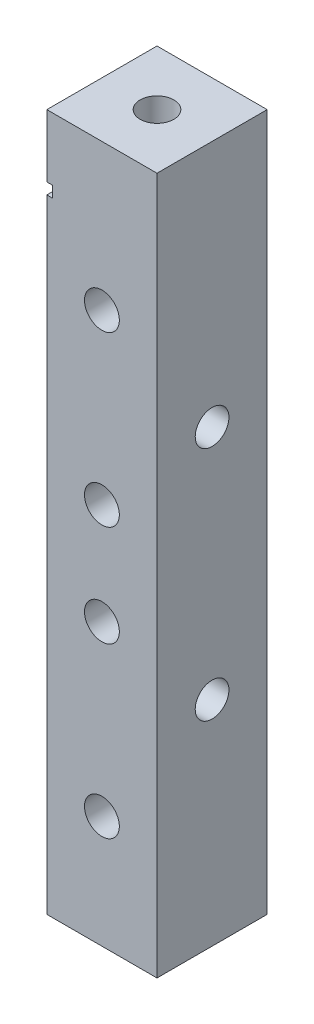
ISO-10303-21;
HEADER;
FILE_DESCRIPTION(('STEP AP214'),'2;1');
FILE_NAME('part.step','',(''),(''),'','','');
FILE_SCHEMA(('AUTOMOTIVE_DESIGN { 1 0 10303 214 1 1 1 1 }'));
ENDSEC;
DATA;
#1=APPLICATION_CONTEXT('core data for automotive mechanical design processes');
#2=APPLICATION_PROTOCOL_DEFINITION('international standard','automotive_design',2000,#1);
#3=PRODUCT_CONTEXT('',#1,'mechanical');
#4=PRODUCT('Part','Part','',(#3));
#5=PRODUCT_RELATED_PRODUCT_CATEGORY('part','',(#4));
#6=PRODUCT_DEFINITION_FORMATION('','',#4);
#7=PRODUCT_DEFINITION_CONTEXT('part definition',#1,'design');
#8=PRODUCT_DEFINITION('design','',#6,#7);
#9=PRODUCT_DEFINITION_SHAPE('','',#8);
#10=(LENGTH_UNIT() NAMED_UNIT(*) SI_UNIT(.MILLI.,.METRE.));
#11=(NAMED_UNIT(*) PLANE_ANGLE_UNIT() SI_UNIT($,.RADIAN.));
#12=(NAMED_UNIT(*) SI_UNIT($,.STERADIAN.) SOLID_ANGLE_UNIT());
#13=UNCERTAINTY_MEASURE_WITH_UNIT(LENGTH_MEASURE(1.E-05),#10,'distance_accuracy_value','');
#14=(GEOMETRIC_REPRESENTATION_CONTEXT(3) GLOBAL_UNCERTAINTY_ASSIGNED_CONTEXT((#13)) GLOBAL_UNIT_ASSIGNED_CONTEXT((#10,
#11,#12)) REPRESENTATION_CONTEXT('',''));
#15=CARTESIAN_POINT('',(0.,0.,0.));
#16=DIRECTION('',(0.,0.,1.));
#17=DIRECTION('',(1.,0.,0.));
#18=AXIS2_PLACEMENT_3D('',#15,#16,#17);
#19=CARTESIAN_POINT('',(-4.9,62.,4.9));
#20=DIRECTION('',(1.,0.,0.));
#21=DIRECTION('',(0.,0.,-1.));
#22=AXIS2_PLACEMENT_3D('',#19,#20,#21);
#23=PLANE('',#22);
#24=DIRECTION('',(0.,-1.,0.));
#25=VECTOR('',#24,1.);
#26=CARTESIAN_POINT('',(-4.9,62.,-4.9));
#27=LINE('',#26,#25);
#28=CARTESIAN_POINT('',(-4.9,62.,-4.9));
#29=VERTEX_POINT('',#28);
#30=CARTESIAN_POINT('',(-4.9,56.4276005837835,-4.9));
#31=VERTEX_POINT('',#30);
#32=EDGE_CURVE('E49',#29,#31,#27,.T.);
#33=ORIENTED_EDGE('',*,*,#32,.T.);
#34=DIRECTION('',(0.,0.,-1.));
#35=VECTOR('',#34,1.);
#36=CARTESIAN_POINT('',(-4.9,56.4276005837835,-4.9));
#37=LINE('',#36,#35);
#38=CARTESIAN_POINT('',(-4.9,56.4276005837835,4.9));
#39=VERTEX_POINT('',#38);
#40=EDGE_CURVE('E131',#39,#31,#37,.T.);
#41=ORIENTED_EDGE('',*,*,#40,.F.);
#42=DIRECTION('',(0.,-1.,0.));
#43=VECTOR('',#42,1.);
#44=CARTESIAN_POINT('',(-4.9,62.,4.9));
#45=LINE('',#44,#43);
#46=CARTESIAN_POINT('',(-4.9,62.,4.9));
#47=VERTEX_POINT('',#46);
#48=EDGE_CURVE('E224',#47,#39,#45,.T.);
#49=ORIENTED_EDGE('',*,*,#48,.F.);
#50=DIRECTION('',(0.,0.,1.));
#51=VECTOR('',#50,1.);
#52=CARTESIAN_POINT('',(-4.9,62.,4.9));
#53=LINE('',#52,#51);
#54=EDGE_CURVE('E203',#29,#47,#53,.T.);
#55=ORIENTED_EDGE('',*,*,#54,.F.);
#56=EDGE_LOOP('',(#33,#41,#49,#55));
#57=FACE_BOUND('',#56,.T.);
#58=ADVANCED_FACE('F39',(#57),#23,.F.);
#59=CARTESIAN_POINT('',(4.9,62.,4.9));
#60=DIRECTION('',(-1.,0.,0.));
#61=DIRECTION('',(0.,0.,1.));
#62=AXIS2_PLACEMENT_3D('',#59,#60,#61);
#63=PLANE('',#62);
#64=CARTESIAN_POINT('',(4.9,40.,0.));
#65=DIRECTION('',(-1.,0.,0.));
#66=DIRECTION('',(0.,0.,1.));
#67=AXIS2_PLACEMENT_3D('',#64,#65,#66);
#68=CIRCLE('',#67,1.5);
#69=CARTESIAN_POINT('',(4.9,40.,1.5));
#70=VERTEX_POINT('',#69);
#71=EDGE_CURVE('E159',#70,#70,#68,.T.);
#72=ORIENTED_EDGE('',*,*,#71,.T.);
#73=EDGE_LOOP('',(#72));
#74=FACE_BOUND('',#73,.T.);
#75=CARTESIAN_POINT('',(4.9,19.,0.));
#76=DIRECTION('',(-1.,0.,0.));
#77=DIRECTION('',(0.,0.,1.));
#78=AXIS2_PLACEMENT_3D('',#75,#76,#77);
#79=CIRCLE('',#78,1.5);
#80=CARTESIAN_POINT('',(4.9,19.,1.5));
#81=VERTEX_POINT('',#80);
#82=EDGE_CURVE('E150',#81,#81,#79,.T.);
#83=ORIENTED_EDGE('',*,*,#82,.T.);
#84=EDGE_LOOP('',(#83));
#85=FACE_BOUND('',#84,.T.);
#86=DIRECTION('',(0.,0.,-1.));
#87=VECTOR('',#86,1.);
#88=CARTESIAN_POINT('',(4.9,0.,4.9));
#89=LINE('',#88,#87);
#90=CARTESIAN_POINT('',(4.9,0.,4.9));
#91=VERTEX_POINT('',#90);
#92=CARTESIAN_POINT('',(4.9,0.,-4.9));
#93=VERTEX_POINT('',#92);
#94=EDGE_CURVE('E197',#91,#93,#89,.T.);
#95=ORIENTED_EDGE('',*,*,#94,.T.);
#96=DIRECTION('',(0.,-1.,0.));
#97=VECTOR('',#96,1.);
#98=CARTESIAN_POINT('',(4.9,62.,-4.9));
#99=LINE('',#98,#97);
#100=CARTESIAN_POINT('',(4.9,62.,-4.9));
#101=VERTEX_POINT('',#100);
#102=EDGE_CURVE('E11',#101,#93,#99,.T.);
#103=ORIENTED_EDGE('',*,*,#102,.F.);
#104=DIRECTION('',(0.,0.,-1.));
#105=VECTOR('',#104,1.);
#106=CARTESIAN_POINT('',(4.9,62.,4.9));
#107=LINE('',#106,#105);
#108=CARTESIAN_POINT('',(4.9,62.,4.9));
#109=VERTEX_POINT('',#108);
#110=EDGE_CURVE('E198',#109,#101,#107,.T.);
#111=ORIENTED_EDGE('',*,*,#110,.F.);
#112=DIRECTION('',(0.,-1.,0.));
#113=VECTOR('',#112,1.);
#114=CARTESIAN_POINT('',(4.9,62.,4.9));
#115=LINE('',#114,#113);
#116=EDGE_CURVE('E208',#109,#91,#115,.T.);
#117=ORIENTED_EDGE('',*,*,#116,.T.);
#118=EDGE_LOOP('',(#95,#103,#111,#117));
#119=FACE_BOUND('',#118,.T.);
#120=ADVANCED_FACE('F41',(#74,#85,#119),#63,.F.);
#121=CARTESIAN_POINT('',(-4.9,62.,-4.9));
#122=DIRECTION('',(0.,0.,1.));
#123=DIRECTION('',(1.,0.,0.));
#124=AXIS2_PLACEMENT_3D('',#121,#122,#123);
#125=PLANE('',#124);
#126=CARTESIAN_POINT('',(0.,10.,-4.9));
#127=DIRECTION('',(0.,0.,-1.));
#128=DIRECTION('',(-1.,0.,0.));
#129=AXIS2_PLACEMENT_3D('',#126,#127,#128);
#130=CIRCLE('',#129,1.55);
#131=CARTESIAN_POINT('',(-1.55,10.,-4.9));
#132=VERTEX_POINT('',#131);
#133=EDGE_CURVE('E164',#132,#132,#130,.T.);
#134=ORIENTED_EDGE('',*,*,#133,.F.);
#135=EDGE_LOOP('',(#134));
#136=FACE_BOUND('',#135,.T.);
#137=CARTESIAN_POINT('',(0.,49.,-4.9));
#138=DIRECTION('',(0.,0.,-1.));
#139=DIRECTION('',(-1.,0.,0.));
#140=AXIS2_PLACEMENT_3D('',#137,#138,#139);
#141=CIRCLE('',#140,1.55);
#142=CARTESIAN_POINT('',(-1.55,49.,-4.9));
#143=VERTEX_POINT('',#142);
#144=EDGE_CURVE('E169',#143,#143,#141,.T.);
#145=ORIENTED_EDGE('',*,*,#144,.F.);
#146=EDGE_LOOP('',(#145));
#147=FACE_BOUND('',#146,.T.);
#148=CARTESIAN_POINT('',(0.,34.,-4.9));
#149=DIRECTION('',(0.,0.,-1.));
#150=DIRECTION('',(-1.,0.,0.));
#151=AXIS2_PLACEMENT_3D('',#148,#149,#150);
#152=CIRCLE('',#151,1.55);
#153=CARTESIAN_POINT('',(-1.55,34.,-4.9));
#154=VERTEX_POINT('',#153);
#155=EDGE_CURVE('E173',#154,#154,#152,.T.);
#156=ORIENTED_EDGE('',*,*,#155,.F.);
#157=EDGE_LOOP('',(#156));
#158=FACE_BOUND('',#157,.T.);
#159=CARTESIAN_POINT('',(0.,25.,-4.9));
#160=DIRECTION('',(0.,0.,-1.));
#161=DIRECTION('',(-1.,0.,0.));
#162=AXIS2_PLACEMENT_3D('',#159,#160,#161);
#163=CIRCLE('',#162,1.55);
#164=CARTESIAN_POINT('',(-1.55,25.,-4.9));
#165=VERTEX_POINT('',#164);
#166=EDGE_CURVE('E163',#165,#165,#163,.T.);
#167=ORIENTED_EDGE('',*,*,#166,.F.);
#168=EDGE_LOOP('',(#167));
#169=FACE_BOUND('',#168,.T.);
#170=DIRECTION('',(0.,-1.,0.));
#171=VECTOR('',#170,1.);
#172=CARTESIAN_POINT('',(-4.4,55.4276005837835,-4.9));
#173=LINE('',#172,#171);
#174=CARTESIAN_POINT('',(-4.4,56.4276005837835,-4.9));
#175=VERTEX_POINT('',#174);
#176=CARTESIAN_POINT('',(-4.4,55.4276005837835,-4.9));
#177=VERTEX_POINT('',#176);
#178=EDGE_CURVE('E122',#175,#177,#173,.T.);
#179=ORIENTED_EDGE('',*,*,#178,.F.);
#180=DIRECTION('',(-1.,0.,0.));
#181=VECTOR('',#180,1.);
#182=CARTESIAN_POINT('',(-4.4,56.4276005837835,-4.9));
#183=LINE('',#182,#181);
#184=EDGE_CURVE('E155',#175,#31,#183,.T.);
#185=ORIENTED_EDGE('',*,*,#184,.T.);
#186=ORIENTED_EDGE('',*,*,#32,.F.);
#187=DIRECTION('',(-1.,0.,0.));
#188=VECTOR('',#187,1.);
#189=CARTESIAN_POINT('',(-4.9,62.,-4.9));
#190=LINE('',#189,#188);
#191=EDGE_CURVE('E93',#101,#29,#190,.T.);
#192=ORIENTED_EDGE('',*,*,#191,.F.);
#193=ORIENTED_EDGE('',*,*,#102,.T.);
#194=DIRECTION('',(-1.,0.,0.));
#195=VECTOR('',#194,1.);
#196=CARTESIAN_POINT('',(-4.9,0.,-4.9));
#197=LINE('',#196,#195);
#198=CARTESIAN_POINT('',(-4.9,0.,-4.9));
#199=VERTEX_POINT('',#198);
#200=EDGE_CURVE('E212',#93,#199,#197,.T.);
#201=ORIENTED_EDGE('',*,*,#200,.T.);
#202=CARTESIAN_POINT('',(-4.9,55.4276005837835,-4.9));
#203=VERTEX_POINT('',#202);
#204=EDGE_CURVE('E136',#203,#199,#27,.T.);
#205=ORIENTED_EDGE('',*,*,#204,.F.);
#206=DIRECTION('',(-1.,0.,0.));
#207=VECTOR('',#206,1.);
#208=CARTESIAN_POINT('',(-4.4,55.4276005837835,-4.9));
#209=LINE('',#208,#207);
#210=EDGE_CURVE('E115',#177,#203,#209,.T.);
#211=ORIENTED_EDGE('',*,*,#210,.F.);
#212=EDGE_LOOP('',(#179,#185,#186,#192,#193,#201,#205,#211));
#213=FACE_BOUND('',#212,.T.);
#214=ADVANCED_FACE('F134',(#136,#147,#158,#169,#213),#125,.F.);
#215=CARTESIAN_POINT('',(-4.9,40.,0.));
#216=DIRECTION('',(-1.,0.,0.));
#217=DIRECTION('',(0.,0.,1.));
#218=AXIS2_PLACEMENT_3D('',#215,#216,#217);
#219=CIRCLE('',#218,1.5);
#220=CARTESIAN_POINT('',(-4.9,40.,1.5));
#221=VERTEX_POINT('',#220);
#222=EDGE_CURVE('E146',#221,#221,#219,.T.);
#223=ORIENTED_EDGE('',*,*,#222,.F.);
#224=EDGE_LOOP('',(#223));
#225=FACE_BOUND('',#224,.T.);
#226=CARTESIAN_POINT('',(-4.9,19.,0.));
#227=DIRECTION('',(-1.,0.,0.));
#228=DIRECTION('',(0.,0.,1.));
#229=AXIS2_PLACEMENT_3D('',#226,#227,#228);
#230=CIRCLE('',#229,1.5);
#231=CARTESIAN_POINT('',(-4.9,19.,1.5));
#232=VERTEX_POINT('',#231);
#233=EDGE_CURVE('E151',#232,#232,#230,.T.);
#234=ORIENTED_EDGE('',*,*,#233,.F.);
#235=EDGE_LOOP('',(#234));
#236=FACE_BOUND('',#235,.T.);
#237=CARTESIAN_POINT('',(-4.9,55.4276005837835,4.9));
#238=VERTEX_POINT('',#237);
#239=CARTESIAN_POINT('',(-4.9,0.,4.9));
#240=VERTEX_POINT('',#239);
#241=EDGE_CURVE('E223',#238,#240,#45,.T.);
#242=ORIENTED_EDGE('',*,*,#241,.F.);
#243=DIRECTION('',(0.,0.,1.));
#244=VECTOR('',#243,1.);
#245=CARTESIAN_POINT('',(-4.9,55.4276005837835,-4.9));
#246=LINE('',#245,#244);
#247=EDGE_CURVE('E299',#203,#238,#246,.T.);
#248=ORIENTED_EDGE('',*,*,#247,.F.);
#249=ORIENTED_EDGE('',*,*,#204,.T.);
#250=DIRECTION('',(0.,0.,1.));
#251=VECTOR('',#250,1.);
#252=CARTESIAN_POINT('',(-4.9,0.,4.9));
#253=LINE('',#252,#251);
#254=EDGE_CURVE('E215',#199,#240,#253,.T.);
#255=ORIENTED_EDGE('',*,*,#254,.T.);
#256=EDGE_LOOP('',(#242,#248,#249,#255));
#257=FACE_BOUND('',#256,.T.);
#258=ADVANCED_FACE('F279',(#225,#236,#257),#23,.F.);
#259=CARTESIAN_POINT('',(-4.9,62.,4.9));
#260=DIRECTION('',(0.,0.,-1.));
#261=DIRECTION('',(-1.,0.,0.));
#262=AXIS2_PLACEMENT_3D('',#259,#260,#261);
#263=PLANE('',#262);
#264=ORIENTED_EDGE('',*,*,#48,.T.);
#265=DIRECTION('',(-1.,0.,0.));
#266=VECTOR('',#265,1.);
#267=CARTESIAN_POINT('',(-4.4,56.4276005837835,4.9));
#268=LINE('',#267,#266);
#269=CARTESIAN_POINT('',(-4.4,56.4276005837835,4.9));
#270=VERTEX_POINT('',#269);
#271=EDGE_CURVE('E141',#270,#39,#268,.T.);
#272=ORIENTED_EDGE('',*,*,#271,.F.);
#273=DIRECTION('',(0.,1.,0.));
#274=VECTOR('',#273,1.);
#275=CARTESIAN_POINT('',(-4.4,55.4276005837835,4.9));
#276=LINE('',#275,#274);
#277=CARTESIAN_POINT('',(-4.4,55.4276005837835,4.9));
#278=VERTEX_POINT('',#277);
#279=EDGE_CURVE('E121',#278,#270,#276,.T.);
#280=ORIENTED_EDGE('',*,*,#279,.F.);
#281=DIRECTION('',(-1.,0.,0.));
#282=VECTOR('',#281,1.);
#283=CARTESIAN_POINT('',(-4.4,55.4276005837835,4.9));
#284=LINE('',#283,#282);
#285=EDGE_CURVE('E118',#278,#238,#284,.T.);
#286=ORIENTED_EDGE('',*,*,#285,.T.);
#287=ORIENTED_EDGE('',*,*,#241,.T.);
#288=DIRECTION('',(1.,0.,0.));
#289=VECTOR('',#288,1.);
#290=CARTESIAN_POINT('',(-4.9,0.,4.9));
#291=LINE('',#290,#289);
#292=EDGE_CURVE('E86',#240,#91,#291,.T.);
#293=ORIENTED_EDGE('',*,*,#292,.T.);
#294=ORIENTED_EDGE('',*,*,#116,.F.);
#295=DIRECTION('',(1.,0.,0.));
#296=VECTOR('',#295,1.);
#297=CARTESIAN_POINT('',(-4.9,62.,4.9));
#298=LINE('',#297,#296);
#299=EDGE_CURVE('E66',#47,#109,#298,.T.);
#300=ORIENTED_EDGE('',*,*,#299,.F.);
#301=EDGE_LOOP('',(#264,#272,#280,#286,#287,#293,#294,#300));
#302=FACE_BOUND('',#301,.T.);
#303=CARTESIAN_POINT('',(0.,10.,4.9));
#304=DIRECTION('',(0.,0.,-1.));
#305=DIRECTION('',(-1.,0.,0.));
#306=AXIS2_PLACEMENT_3D('',#303,#304,#305);
#307=CIRCLE('',#306,1.55);
#308=CARTESIAN_POINT('',(-1.55,10.,4.9));
#309=VERTEX_POINT('',#308);
#310=EDGE_CURVE('E180',#309,#309,#307,.T.);
#311=ORIENTED_EDGE('',*,*,#310,.T.);
#312=EDGE_LOOP('',(#311));
#313=FACE_BOUND('',#312,.T.);
#314=CARTESIAN_POINT('',(0.,49.,4.9));
#315=DIRECTION('',(0.,0.,-1.));
#316=DIRECTION('',(-1.,0.,0.));
#317=AXIS2_PLACEMENT_3D('',#314,#315,#316);
#318=CIRCLE('',#317,1.55);
#319=CARTESIAN_POINT('',(-1.55,49.,4.9));
#320=VERTEX_POINT('',#319);
#321=EDGE_CURVE('E43',#320,#320,#318,.T.);
#322=ORIENTED_EDGE('',*,*,#321,.T.);
#323=EDGE_LOOP('',(#322));
#324=FACE_BOUND('',#323,.T.);
#325=CARTESIAN_POINT('',(0.,34.,4.9));
#326=DIRECTION('',(0.,0.,-1.));
#327=DIRECTION('',(-1.,0.,0.));
#328=AXIS2_PLACEMENT_3D('',#325,#326,#327);
#329=CIRCLE('',#328,1.55);
#330=CARTESIAN_POINT('',(-1.55,34.,4.9));
#331=VERTEX_POINT('',#330);
#332=EDGE_CURVE('E306',#331,#331,#329,.T.);
#333=ORIENTED_EDGE('',*,*,#332,.T.);
#334=EDGE_LOOP('',(#333));
#335=FACE_BOUND('',#334,.T.);
#336=CARTESIAN_POINT('',(0.,25.,4.9));
#337=DIRECTION('',(0.,0.,-1.));
#338=DIRECTION('',(-1.,0.,0.));
#339=AXIS2_PLACEMENT_3D('',#336,#337,#338);
#340=CIRCLE('',#339,1.55);
#341=CARTESIAN_POINT('',(-1.55,25.,4.9));
#342=VERTEX_POINT('',#341);
#343=EDGE_CURVE('E184',#342,#342,#340,.T.);
#344=ORIENTED_EDGE('',*,*,#343,.T.);
#345=EDGE_LOOP('',(#344));
#346=FACE_BOUND('',#345,.T.);
#347=ADVANCED_FACE('F286',(#302,#313,#324,#335,#346),#263,.F.);
#348=CARTESIAN_POINT('',(0.,62.,0.));
#349=DIRECTION('',(0.,-1.,0.));
#350=DIRECTION('',(0.,0.,-1.));
#351=AXIS2_PLACEMENT_3D('',#348,#349,#350);
#352=PLANE('',#351);
#353=CARTESIAN_POINT('',(0.,62.,0.));
#354=DIRECTION('',(0.,1.,0.));
#355=DIRECTION('',(0.,0.,1.));
#356=AXIS2_PLACEMENT_3D('',#353,#354,#355);
#357=CIRCLE('',#356,1.5);
#358=CARTESIAN_POINT('',(0.,62.,1.5));
#359=VERTEX_POINT('',#358);
#360=EDGE_CURVE('E190',#359,#359,#357,.T.);
#361=ORIENTED_EDGE('',*,*,#360,.F.);
#362=EDGE_LOOP('',(#361));
#363=FACE_BOUND('',#362,.T.);
#364=ORIENTED_EDGE('',*,*,#110,.T.);
#365=ORIENTED_EDGE('',*,*,#191,.T.);
#366=ORIENTED_EDGE('',*,*,#54,.T.);
#367=ORIENTED_EDGE('',*,*,#299,.T.);
#368=EDGE_LOOP('',(#364,#365,#366,#367));
#369=FACE_BOUND('',#368,.T.);
#370=ADVANCED_FACE('F292',(#363,#369),#352,.F.);
#371=CARTESIAN_POINT('',(0.,0.,0.));
#372=DIRECTION('',(0.,-1.,0.));
#373=DIRECTION('',(0.,0.,-1.));
#374=AXIS2_PLACEMENT_3D('',#371,#372,#373);
#375=PLANE('',#374);
#376=CARTESIAN_POINT('',(0.,0.,0.));
#377=DIRECTION('',(0.,-1.,0.));
#378=DIRECTION('',(0.,0.,-1.));
#379=AXIS2_PLACEMENT_3D('',#376,#377,#378);
#380=CIRCLE('',#379,1.5);
#381=CARTESIAN_POINT('',(0.,0.,-1.5));
#382=VERTEX_POINT('',#381);
#383=EDGE_CURVE('E189',#382,#382,#380,.T.);
#384=ORIENTED_EDGE('',*,*,#383,.F.);
#385=EDGE_LOOP('',(#384));
#386=FACE_BOUND('',#385,.T.);
#387=ORIENTED_EDGE('',*,*,#94,.F.);
#388=ORIENTED_EDGE('',*,*,#292,.F.);
#389=ORIENTED_EDGE('',*,*,#254,.F.);
#390=ORIENTED_EDGE('',*,*,#200,.F.);
#391=EDGE_LOOP('',(#387,#388,#389,#390));
#392=FACE_BOUND('',#391,.T.);
#393=ADVANCED_FACE('F272',(#386,#392),#375,.T.);
#394=CARTESIAN_POINT('',(0.,10.,0.));
#395=DIRECTION('',(0.,-1.,0.));
#396=DIRECTION('',(0.,0.,-1.));
#397=AXIS2_PLACEMENT_3D('',#394,#395,#396);
#398=CYLINDRICAL_SURFACE('',#397,1.5);
#399=CARTESIAN_POINT('',(0.,8.45,-1.5));
#400=CARTESIAN_POINT('',(-0.0676355330274347,8.45000918156954,-1.49999076368759));
#401=CARTESIAN_POINT('',(-0.135385038064902,8.45447269184044,-1.49537962706916));
#402=CARTESIAN_POINT('',(-0.268656128092146,8.47197059082042,-1.47728767559424));
#403=CARTESIAN_POINT('',(-0.334170585245084,8.48503011379671,-1.46378085016549));
#404=CARTESIAN_POINT('',(-0.460531661005092,8.51856394551889,-1.42904623801899));
#405=CARTESIAN_POINT('',(-0.521408709249812,8.53898374636987,-1.40787520512207));
#406=CARTESIAN_POINT('',(-0.637888892089839,8.58594598127585,-1.35907782461948));
#407=CARTESIAN_POINT('',(-0.693492939511153,8.61248735286579,-1.33145259719854));
#408=CARTESIAN_POINT('',(-0.820581634788787,8.68229850418099,-1.25856612544725));
#409=CARTESIAN_POINT('',(-0.88925641215993,8.72796974037933,-1.21071351864878));
#410=CARTESIAN_POINT('',(-1.01520576989899,8.82600819846327,-1.1072649019925));
#411=CARTESIAN_POINT('',(-1.07244587684375,8.87839490949694,-1.05164631060456));
#412=CARTESIAN_POINT('',(-1.15905645809111,8.96963122756111,-0.953607279457472));
#413=CARTESIAN_POINT('',(-1.19144642006318,9.00736433299335,-0.912752810296735));
#414=CARTESIAN_POINT('',(-1.25138700905586,9.08408521257302,-0.82867328414724));
#415=CARTESIAN_POINT('',(-1.27893455042558,9.1230737681244,-0.785446738492737));
#416=CARTESIAN_POINT('',(-1.32929209619449,9.20146994680698,-0.696833182201779));
#417=CARTESIAN_POINT('',(-1.35210921725435,9.2408768452724,-0.651449545125146));
#418=CARTESIAN_POINT('',(-1.393168512786,9.31917516696832,-0.558281901258092));
#419=CARTESIAN_POINT('',(-1.41141486057361,9.35806702948649,-0.510500132277131));
#420=CARTESIAN_POINT('',(-1.43796585474672,9.42077975282997,-0.42829625229903));
#421=CARTESIAN_POINT('',(-1.44754930690894,9.44526581217697,-0.394793082810678));
#422=CARTESIAN_POINT('',(-1.46463329583353,9.49209949405836,-0.325757044589731));
#423=CARTESIAN_POINT('',(-1.4721343935952,9.51444769148067,-0.290224725639021));
#424=CARTESIAN_POINT('',(-1.48283152463227,9.54841999775361,-0.227765705300915));
#425=CARTESIAN_POINT('',(-1.48664094036618,9.56121794397821,-0.201598588556089));
#426=CARTESIAN_POINT('',(-1.4929607756499,9.58322749209445,-0.147648662602035));
#427=CARTESIAN_POINT('',(-1.49547530893552,9.59245042811956,-0.119871285903428));
#428=CARTESIAN_POINT('',(-1.49854011071256,9.60388718576807,-0.0696488705695378));
#429=CARTESIAN_POINT('',(-1.49941413846041,9.60724230516123,-0.0474949175940226));
#430=CARTESIAN_POINT('',(-1.50016193526527,9.61010619155939,-0.00293704360336293));
#431=CARTESIAN_POINT('',(-1.50003712302609,9.60962041399963,0.0194664777549361));
#432=CARTESIAN_POINT('',(-1.4988087528499,9.60493485458823,0.0637405196491237));
#433=CARTESIAN_POINT('',(-1.49770901081175,9.60074955294884,0.0856127769940214));
#434=CARTESIAN_POINT('',(-1.49463886434278,9.58940218957879,0.128523150692402));
#435=CARTESIAN_POINT('',(-1.49266644232334,9.58223323209036,0.149559210252956));
#436=CARTESIAN_POINT('',(-1.48421675577554,9.55271041124499,0.223657981801551));
#437=CARTESIAN_POINT('',(-1.4755864871079,9.52443615422717,0.274006818990341));
#438=CARTESIAN_POINT('',(-1.45432019738923,9.46282126054105,0.3707000130017));
#439=CARTESIAN_POINT('',(-1.44164953074072,9.42943815424763,0.417005151031959));
#440=CARTESIAN_POINT('',(-1.41119167479361,9.35758684172683,0.511064647631191));
#441=CARTESIAN_POINT('',(-1.39304229169764,9.3189328823417,0.558563645420754));
#442=CARTESIAN_POINT('',(-1.35222893717829,9.24110673602219,0.651182558962817));
#443=CARTESIAN_POINT('',(-1.32956049851527,9.20193407239068,0.696300064263315));
#444=CARTESIAN_POINT('',(-1.27968080639219,9.12419023394033,0.784193050296158));
#445=CARTESIAN_POINT('',(-1.25248535967424,9.08561745984143,0.826976015280608));
#446=CARTESIAN_POINT('',(-1.19335707270958,9.00968970525255,0.910221382682543));
#447=CARTESIAN_POINT('',(-1.16142733296675,8.97233394711886,0.950685279996671));
#448=CARTESIAN_POINT('',(-1.07706051760182,8.88297815921811,1.04674557237139));
#449=CARTESIAN_POINT('',(-1.02187542128091,8.83198609078293,1.10092025676002));
#450=CARTESIAN_POINT('',(-0.900638243110865,8.73615428334693,1.20210845619783));
#451=CARTESIAN_POINT('',(-0.83460036052106,8.69130664402236,1.24913117576794));
#452=CARTESIAN_POINT('',(-0.707364744329673,8.61933165808678,1.32432447255157));
#453=CARTESIAN_POINT('',(-0.648265804662616,8.59047383471137,1.35436901934159));
#454=CARTESIAN_POINT('',(-0.524040425774704,8.53973556055681,1.4070976405335));
#455=CARTESIAN_POINT('',(-0.458917640809046,8.51785091498213,1.42978614019492));
#456=CARTESIAN_POINT('',(-0.323357261638111,8.4824747315554,1.46642625354189));
#457=CARTESIAN_POINT('',(-0.252877834811469,8.46905896986772,1.48029899450935));
#458=CARTESIAN_POINT('',(-0.109496119878111,8.45219369615798,1.49773477723689));
#459=CARTESIAN_POINT('',(-0.0365960895639514,8.44873514690697,1.50130716766464));
#460=CARTESIAN_POINT('',(0.0984919810263604,8.4518668569271,1.49807077570084));
#461=CARTESIAN_POINT('',(0.160752682035313,8.45711977940188,1.49264357327161));
#462=CARTESIAN_POINT('',(0.283103371878415,8.47482027927021,1.4743400470884));
#463=CARTESIAN_POINT('',(0.343193125040616,8.48726863530102,1.46146291715755));
#464=CARTESIAN_POINT('',(0.459883486074463,8.51855902740026,1.42905052963416));
#465=CARTESIAN_POINT('',(0.516477558519102,8.53741263500286,1.40950322161571));
#466=CARTESIAN_POINT('',(0.625185056628199,8.58046896397594,1.36477262584326));
#467=CARTESIAN_POINT('',(0.677296955637239,8.60467349796088,1.33958742823013));
#468=CARTESIAN_POINT('',(0.801143016952392,8.67044468057698,1.27096788234545));
#469=CARTESIAN_POINT('',(0.869873446620273,8.71468555326446,1.22466038028739));
#470=CARTESIAN_POINT('',(0.996221572518763,8.80989739296327,1.12431589332918));
#471=CARTESIAN_POINT('',(1.05380501309098,8.86088831968371,1.07025594356351));
#472=CARTESIAN_POINT('',(1.17684019417417,8.98622760660235,0.935983133725118));
#473=CARTESIAN_POINT('',(1.23776700867065,9.06241780672806,0.853321684154401));
#474=CARTESIAN_POINT('',(1.31518074653592,9.17843437441746,0.723076291723836));
#475=CARTESIAN_POINT('',(1.33865419259974,9.21739095593666,0.678623918908576));
#476=CARTESIAN_POINT('',(1.38111453148268,9.2950411942485,0.587416395735565));
#477=CARTESIAN_POINT('',(1.40010488794506,9.3337350314397,0.540663057083083));
#478=CARTESIAN_POINT('',(1.42865852656186,9.39809925326386,0.458500862904447));
#479=CARTESIAN_POINT('',(1.43934747871828,9.42422957771131,0.423838314297146));
#480=CARTESIAN_POINT('',(1.45846916957239,9.47456259841746,0.352472624538713));
#481=CARTESIAN_POINT('',(1.46690169224685,9.49876510995794,0.315769288415189));
#482=CARTESIAN_POINT('',(1.47915836826865,9.53646807833629,0.250677921752169));
#483=CARTESIAN_POINT('',(1.48360817410217,9.5510196503004,0.223030116501165));
#484=CARTESIAN_POINT('',(1.49107253782405,9.57646979684222,0.165910357502043));
#485=CARTESIAN_POINT('',(1.4940916438818,9.5873799143872,0.136444525482611));
#486=CARTESIAN_POINT('',(1.49778533654472,9.60103148306267,0.0843429613326786));
#487=CARTESIAN_POINT('',(1.49888133135799,9.60520996532598,0.0621296678733493));
#488=CARTESIAN_POINT('',(1.50006670712492,9.60973547729636,0.0173100698479112));
#489=CARTESIAN_POINT('',(1.50015818188905,9.61009047659924,-0.0052953188280066));
#490=CARTESIAN_POINT('',(1.49932930092276,9.60691856242145,-0.0501558907840649));
#491=CARTESIAN_POINT('',(1.4984106800186,9.60339830463279,-0.072411608126628));
#492=CARTESIAN_POINT('',(1.49565869150687,9.59314130297683,-0.116131767269246));
#493=CARTESIAN_POINT('',(1.49382290141957,9.58639604308988,-0.13759395104916));
#494=CARTESIAN_POINT('',(1.48628457398181,9.5597508137054,-0.208567560535189));
#495=CARTESIAN_POINT('',(1.47874616727958,9.53456194851549,-0.255806476178963));
#496=CARTESIAN_POINT('',(1.46016045684435,9.47911745019852,-0.346545579722542));
#497=CARTESIAN_POINT('',(1.44908454359009,9.44882149129398,-0.390011475214173));
#498=CARTESIAN_POINT('',(1.42262028470986,9.38356594494441,-0.477930212167644));
#499=CARTESIAN_POINT('',(1.40695141884877,9.34842782763852,-0.52216831315905));
#500=CARTESIAN_POINT('',(1.37182844375827,9.27738787066879,-0.608487457482874));
#501=CARTESIAN_POINT('',(1.35237085660004,9.24148535648992,-0.650566473654522));
#502=CARTESIAN_POINT('',(1.28834402847885,9.13422284195915,-0.773780585964466));
#503=CARTESIAN_POINT('',(1.23801928130951,9.06303991244737,-0.85222537758821));
#504=CARTESIAN_POINT('',(1.13058528030716,8.9369815038749,-0.988958148128446));
#505=CARTESIAN_POINT('',(1.07590721072425,8.88133568349484,-1.04845021921722));
#506=CARTESIAN_POINT('',(0.954447838165005,8.77608914405424,-1.16009192792528));
#507=CARTESIAN_POINT('',(0.887682056914302,8.72648080736193,-1.21225083115026));
#508=CARTESIAN_POINT('',(0.759622362999406,8.64734012479527,-1.29510454046087));
#509=CARTESIAN_POINT('',(0.700925812060821,8.61585634210812,-1.32793739889535));
#510=CARTESIAN_POINT('',(0.576916619219177,8.55976430134582,-1.38630627969615));
#511=CARTESIAN_POINT('',(0.511609170745637,8.53515070239879,-1.41184797055948));
#512=CARTESIAN_POINT('',(0.385513160447913,8.49748082148572,-1.45089136321837));
#513=CARTESIAN_POINT('',(0.325447285448141,8.48326475230649,-1.46560339794699));
#514=CARTESIAN_POINT('',(0.202808330107051,8.46207550537891,-1.48752141126474));
#515=CARTESIAN_POINT('',(0.140242701642873,8.45508225780519,-1.49474818906005));
#516=CARTESIAN_POINT('',(0.0516188490255184,8.45064202597325,-1.49933651331712));
#517=CARTESIAN_POINT('',(0.0258177278832467,8.44999649522591,-1.50000352567046));
#518=CARTESIAN_POINT('',(0.,8.45,-1.5));
#519=B_SPLINE_CURVE_WITH_KNOTS('',3,(#399,#400,#401,#402,#403,#404,#405,#406,#407,#408,#409,
#410,#411,#412,#413,#414,#415,#416,#417,#418,#419,#420,#421,#422,#423,#424,#425,#426,#427,#428,
#429,#430,#431,#432,#433,#434,#435,#436,#437,#438,#439,#440,#441,#442,#443,#444,#445,#446,#447,
#448,#449,#450,#451,#452,#453,#454,#455,#456,#457,#458,#459,#460,#461,#462,#463,#464,#465,#466,
#467,#468,#469,#470,#471,#472,#473,#474,#475,#476,#477,#478,#479,#480,#481,#482,#483,#484,#485,
#486,#487,#488,#489,#490,#491,#492,#493,#494,#495,#496,#497,#498,#499,#500,#501,#502,#503,#504,
#505,#506,#507,#508,#509,#510,#511,#512,#513,#514,#515,#516,#517,#518),.UNSPECIFIED.,.T.,.F.,(4,
2,2,2,2,2,2,2,2,2,2,2,2,2,2,2,2,2,2,2,2,2,2,2,2,2,2,2,2,2,2,2,2,2,2,2,2,2,2,2,2,2,2,2,2,2,2,2,2,
2,2,2,2,2,2,2,2,2,2,4),(0.,0.202814510369214,0.406224689313204,0.608158425619281,
0.810057140472106,1.09455653609654,1.37990111332596,1.57274966281357,1.76572065582805,
1.95839919330287,2.15090116032281,2.27858497539441,2.4062343581913,2.49419225375971,
2.58186896309507,2.64882662460042,2.71568919959281,2.78229122263704,2.84904803716171,
3.02281253929226,3.19810902344747,3.38945227765542,3.58098562755563,3.771863722358,
3.96261735814807,4.23954415156451,4.51611147046011,4.73220774613691,4.94817378010337,
5.16604577824917,5.38371997195822,5.57096073943538,5.75822177253495,5.94582292075648,
6.13348771609463,6.41374072185358,6.69484175338967,7.07625320432196,7.26691917178743,
7.45743734471188,7.59146972942438,7.72551494137498,7.82002553343696,7.91423362831897,
7.98182424901708,8.04927395776678,8.11660800320234,8.18412084292244,8.34503439109424,
8.5072837593348,8.6829271905856,8.85873262372911,9.20903785981627,9.50242130990279,
9.7954306669257,10.0174065500662,10.239209385751,10.428776534471,10.61781551016,
10.6952335418529),.UNSPECIFIED.);
#520=CARTESIAN_POINT('',(0.,8.45,-1.5));
#521=VERTEX_POINT('',#520);
#522=EDGE_CURVE('E168',#521,#521,#519,.T.);
#523=ORIENTED_EDGE('',*,*,#522,.T.);
#524=EDGE_LOOP('',(#523));
#525=FACE_BOUND('',#524,.T.);
#526=ORIENTED_EDGE('',*,*,#383,.T.);
#527=EDGE_LOOP('',(#526));
#528=FACE_BOUND('',#527,.T.);
#529=ADVANCED_FACE('F239',(#525,#528),#398,.F.);
#530=CARTESIAN_POINT('',(0.,52.,0.));
#531=DIRECTION('',(0.,1.,0.));
#532=DIRECTION('',(0.,0.,1.));
#533=AXIS2_PLACEMENT_3D('',#530,#531,#532);
#534=CYLINDRICAL_SURFACE('',#533,1.5);
#535=CARTESIAN_POINT('',(0.,52.,0.));
#536=DIRECTION('',(0.,1.,0.));
#537=DIRECTION('',(0.,0.,1.));
#538=AXIS2_PLACEMENT_3D('',#535,#536,#537);
#539=CIRCLE('',#538,1.5);
#540=CARTESIAN_POINT('',(0.,52.,1.5));
#541=VERTEX_POINT('',#540);
#542=EDGE_CURVE('E185',#541,#541,#539,.T.);
#543=ORIENTED_EDGE('',*,*,#542,.F.);
#544=EDGE_LOOP('',(#543));
#545=FACE_BOUND('',#544,.T.);
#546=ORIENTED_EDGE('',*,*,#360,.T.);
#547=EDGE_LOOP('',(#546));
#548=FACE_BOUND('',#547,.T.);
#549=ADVANCED_FACE('F265',(#545,#548),#534,.F.);
#550=CARTESIAN_POINT('',(0.,52.,0.));
#551=DIRECTION('',(0.,1.,0.));
#552=DIRECTION('',(0.,0.,1.));
#553=AXIS2_PLACEMENT_3D('',#550,#551,#552);
#554=PLANE('',#553);
#555=ORIENTED_EDGE('',*,*,#542,.T.);
#556=EDGE_LOOP('',(#555));
#557=FACE_BOUND('',#556,.T.);
#558=ADVANCED_FACE('F249',(#557),#554,.T.);
#559=CARTESIAN_POINT('',(0.,10.,5.1));
#560=DIRECTION('',(0.,0.,-1.));
#561=DIRECTION('',(-1.,0.,0.));
#562=AXIS2_PLACEMENT_3D('',#559,#560,#561);
#563=CYLINDRICAL_SURFACE('',#562,1.55);
#564=ORIENTED_EDGE('',*,*,#522,.F.);
#565=EDGE_LOOP('',(#564));
#566=FACE_BOUND('',#565,.T.);
#567=ORIENTED_EDGE('',*,*,#133,.T.);
#568=EDGE_LOOP('',(#567));
#569=FACE_BOUND('',#568,.T.);
#570=ORIENTED_EDGE('',*,*,#310,.F.);
#571=EDGE_LOOP('',(#570));
#572=FACE_BOUND('',#571,.T.);
#573=ADVANCED_FACE('F243',(#566,#569,#572),#563,.F.);
#574=CARTESIAN_POINT('',(0.,25.,5.1));
#575=DIRECTION('',(0.,0.,-1.));
#576=DIRECTION('',(-1.,0.,0.));
#577=AXIS2_PLACEMENT_3D('',#574,#575,#576);
#578=CYLINDRICAL_SURFACE('',#577,1.55);
#579=ORIENTED_EDGE('',*,*,#166,.T.);
#580=EDGE_LOOP('',(#579));
#581=FACE_BOUND('',#580,.T.);
#582=ORIENTED_EDGE('',*,*,#343,.F.);
#583=EDGE_LOOP('',(#582));
#584=FACE_BOUND('',#583,.T.);
#585=ADVANCED_FACE('F248',(#581,#584),#578,.F.);
#586=CARTESIAN_POINT('',(0.,34.,5.1));
#587=DIRECTION('',(0.,0.,-1.));
#588=DIRECTION('',(-1.,0.,0.));
#589=AXIS2_PLACEMENT_3D('',#586,#587,#588);
#590=CYLINDRICAL_SURFACE('',#589,1.55);
#591=ORIENTED_EDGE('',*,*,#155,.T.);
#592=EDGE_LOOP('',(#591));
#593=FACE_BOUND('',#592,.T.);
#594=ORIENTED_EDGE('',*,*,#332,.F.);
#595=EDGE_LOOP('',(#594));
#596=FACE_BOUND('',#595,.T.);
#597=ADVANCED_FACE('F256',(#593,#596),#590,.F.);
#598=CARTESIAN_POINT('',(0.,49.,5.1));
#599=DIRECTION('',(0.,0.,-1.));
#600=DIRECTION('',(-1.,0.,0.));
#601=AXIS2_PLACEMENT_3D('',#598,#599,#600);
#602=CYLINDRICAL_SURFACE('',#601,1.55);
#603=ORIENTED_EDGE('',*,*,#144,.T.);
#604=EDGE_LOOP('',(#603));
#605=FACE_BOUND('',#604,.T.);
#606=ORIENTED_EDGE('',*,*,#321,.F.);
#607=EDGE_LOOP('',(#606));
#608=FACE_BOUND('',#607,.T.);
#609=ADVANCED_FACE('F253',(#605,#608),#602,.F.);
#610=CARTESIAN_POINT('',(5.1,19.,0.));
#611=DIRECTION('',(-1.,0.,0.));
#612=DIRECTION('',(0.,0.,1.));
#613=AXIS2_PLACEMENT_3D('',#610,#611,#612);
#614=CYLINDRICAL_SURFACE('',#613,1.5);
#615=ORIENTED_EDGE('',*,*,#233,.T.);
#616=EDGE_LOOP('',(#615));
#617=FACE_BOUND('',#616,.T.);
#618=ORIENTED_EDGE('',*,*,#82,.F.);
#619=EDGE_LOOP('',(#618));
#620=FACE_BOUND('',#619,.T.);
#621=ADVANCED_FACE('F251',(#617,#620),#614,.F.);
#622=CARTESIAN_POINT('',(5.1,40.,0.));
#623=DIRECTION('',(-1.,0.,0.));
#624=DIRECTION('',(0.,0.,1.));
#625=AXIS2_PLACEMENT_3D('',#622,#623,#624);
#626=CYLINDRICAL_SURFACE('',#625,1.5);
#627=ORIENTED_EDGE('',*,*,#222,.T.);
#628=EDGE_LOOP('',(#627));
#629=FACE_BOUND('',#628,.T.);
#630=ORIENTED_EDGE('',*,*,#71,.F.);
#631=EDGE_LOOP('',(#630));
#632=FACE_BOUND('',#631,.T.);
#633=ADVANCED_FACE('F359',(#629,#632),#626,.F.);
#634=CARTESIAN_POINT('',(-4.4,56.4276005837835,-4.9));
#635=DIRECTION('',(0.,1.,0.));
#636=DIRECTION('',(0.,0.,1.));
#637=AXIS2_PLACEMENT_3D('',#634,#635,#636);
#638=PLANE('',#637);
#639=ORIENTED_EDGE('',*,*,#40,.T.);
#640=ORIENTED_EDGE('',*,*,#184,.F.);
#641=DIRECTION('',(0.,0.,-1.));
#642=VECTOR('',#641,1.);
#643=CARTESIAN_POINT('',(-4.4,56.4276005837835,-4.9));
#644=LINE('',#643,#642);
#645=EDGE_CURVE('E128',#270,#175,#644,.T.);
#646=ORIENTED_EDGE('',*,*,#645,.F.);
#647=ORIENTED_EDGE('',*,*,#271,.T.);
#648=EDGE_LOOP('',(#639,#640,#646,#647));
#649=FACE_BOUND('',#648,.T.);
#650=ADVANCED_FACE('F322',(#649),#638,.F.);
#651=CARTESIAN_POINT('',(-4.4,55.4276005837835,-4.9));
#652=DIRECTION('',(0.,-1.,0.));
#653=DIRECTION('',(0.,0.,-1.));
#654=AXIS2_PLACEMENT_3D('',#651,#652,#653);
#655=PLANE('',#654);
#656=ORIENTED_EDGE('',*,*,#247,.T.);
#657=ORIENTED_EDGE('',*,*,#285,.F.);
#658=DIRECTION('',(0.,0.,1.));
#659=VECTOR('',#658,1.);
#660=CARTESIAN_POINT('',(-4.4,55.4276005837835,-4.9));
#661=LINE('',#660,#659);
#662=EDGE_CURVE('E57',#177,#278,#661,.T.);
#663=ORIENTED_EDGE('',*,*,#662,.F.);
#664=ORIENTED_EDGE('',*,*,#210,.T.);
#665=EDGE_LOOP('',(#656,#657,#663,#664));
#666=FACE_BOUND('',#665,.T.);
#667=ADVANCED_FACE('F113',(#666),#655,.F.);
#668=CARTESIAN_POINT('',(-4.4,0.,0.));
#669=DIRECTION('',(1.,0.,0.));
#670=DIRECTION('',(0.,0.,-1.));
#671=AXIS2_PLACEMENT_3D('',#668,#669,#670);
#672=PLANE('',#671);
#673=ORIENTED_EDGE('',*,*,#178,.T.);
#674=ORIENTED_EDGE('',*,*,#662,.T.);
#675=ORIENTED_EDGE('',*,*,#279,.T.);
#676=ORIENTED_EDGE('',*,*,#645,.T.);
#677=EDGE_LOOP('',(#673,#674,#675,#676));
#678=FACE_BOUND('',#677,.T.);
#679=ADVANCED_FACE('F126',(#678),#672,.F.);
#680=CLOSED_SHELL('',(#58,#120,#214,#258,#347,#370,#393,#529,#549,#558,#573,#585,#597,#609,#621,
#633,#650,#667,#679));
#681=MANIFOLD_SOLID_BREP('B2',#680);
#682=ADVANCED_BREP_SHAPE_REPRESENTATION('',(#18,#681),#14);
#683=SHAPE_DEFINITION_REPRESENTATION(#9,#682);
ENDSEC;
END-ISO-10303-21;
